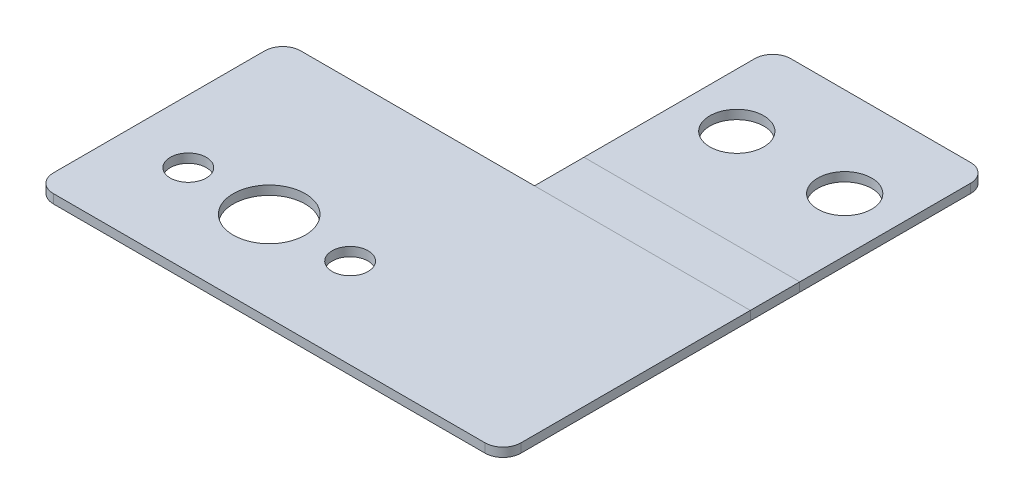
ISO-10303-21;
HEADER;
FILE_DESCRIPTION(('STEP AP214'),'2;1');
FILE_NAME('part.step','',(''),(''),'','','');
FILE_SCHEMA(('AUTOMOTIVE_DESIGN { 1 0 10303 214 1 1 1 1 }'));
ENDSEC;
DATA;
#1=APPLICATION_CONTEXT('core data for automotive mechanical design processes');
#2=APPLICATION_PROTOCOL_DEFINITION('international standard','automotive_design',2000,#1);
#3=PRODUCT_CONTEXT('',#1,'mechanical');
#4=PRODUCT('Part','Part','',(#3));
#5=PRODUCT_RELATED_PRODUCT_CATEGORY('part','',(#4));
#6=PRODUCT_DEFINITION_FORMATION('','',#4);
#7=PRODUCT_DEFINITION_CONTEXT('part definition',#1,'design');
#8=PRODUCT_DEFINITION('design','',#6,#7);
#9=PRODUCT_DEFINITION_SHAPE('','',#8);
#10=(LENGTH_UNIT() NAMED_UNIT(*) SI_UNIT(.MILLI.,.METRE.));
#11=(NAMED_UNIT(*) PLANE_ANGLE_UNIT() SI_UNIT($,.RADIAN.));
#12=(NAMED_UNIT(*) SI_UNIT($,.STERADIAN.) SOLID_ANGLE_UNIT());
#13=UNCERTAINTY_MEASURE_WITH_UNIT(LENGTH_MEASURE(1.E-05),#10,'distance_accuracy_value','');
#14=(GEOMETRIC_REPRESENTATION_CONTEXT(3) GLOBAL_UNCERTAINTY_ASSIGNED_CONTEXT((#13)) GLOBAL_UNIT_ASSIGNED_CONTEXT((#10,
#11,#12)) REPRESENTATION_CONTEXT('',''));
#15=CARTESIAN_POINT('',(0.,0.,0.));
#16=DIRECTION('',(0.,0.,1.));
#17=DIRECTION('',(1.,0.,0.));
#18=AXIS2_PLACEMENT_3D('',#15,#16,#17);
#19=CARTESIAN_POINT('',(6.,-0.5,-13.5));
#20=DIRECTION('',(1.,0.,0.));
#21=DIRECTION('',(0.,0.,-1.));
#22=AXIS2_PLACEMENT_3D('',#19,#20,#21);
#23=PLANE('',#22);
#24=DIRECTION('',(0.,0.,-1.));
#25=VECTOR('',#24,1.);
#26=CARTESIAN_POINT('',(6.,0.,-13.5));
#27=LINE('',#26,#25);
#28=CARTESIAN_POINT('',(6.,0.,12.5));
#29=VERTEX_POINT('',#28);
#30=CARTESIAN_POINT('',(6.,0.,-0.251106428108928));
#31=VERTEX_POINT('',#30);
#32=EDGE_CURVE('E211',#29,#31,#27,.T.);
#33=ORIENTED_EDGE('',*,*,#32,.F.);
#34=DIRECTION('',(0.,1.,0.));
#35=VECTOR('',#34,1.);
#36=CARTESIAN_POINT('',(6.,-0.5,12.5));
#37=LINE('',#36,#35);
#38=CARTESIAN_POINT('',(6.,-0.5,12.5));
#39=VERTEX_POINT('',#38);
#40=EDGE_CURVE('E167',#29,#39,#37,.F.);
#41=ORIENTED_EDGE('',*,*,#40,.T.);
#42=DIRECTION('',(0.,0.,-1.));
#43=VECTOR('',#42,1.);
#44=CARTESIAN_POINT('',(6.,-0.5,-13.5));
#45=LINE('',#44,#43);
#46=CARTESIAN_POINT('',(6.,-0.5,-0.25110642810893));
#47=VERTEX_POINT('',#46);
#48=EDGE_CURVE('E215',#39,#47,#45,.T.);
#49=ORIENTED_EDGE('',*,*,#48,.T.);
#50=DIRECTION('',(0.,1.,0.));
#51=VECTOR('',#50,1.);
#52=CARTESIAN_POINT('',(6.,-0.499999999999999,-0.251106428108928));
#53=LINE('',#52,#51);
#54=EDGE_CURVE('E12',#47,#31,#53,.T.);
#55=ORIENTED_EDGE('',*,*,#54,.T.);
#56=EDGE_LOOP('',(#33,#41,#49,#55));
#57=FACE_BOUND('',#56,.T.);
#58=ADVANCED_FACE('F43',(#57),#23,.T.);
#59=CARTESIAN_POINT('',(0.,0.,0.));
#60=DIRECTION('',(0.,1.,0.));
#61=DIRECTION('',(0.,0.,1.));
#62=AXIS2_PLACEMENT_3D('',#59,#60,#61);
#63=PLANE('',#62);
#64=CARTESIAN_POINT('',(-16.5,0.,8.49999999999999));
#65=DIRECTION('',(0.,1.,0.));
#66=DIRECTION('',(0.,0.,1.));
#67=AXIS2_PLACEMENT_3D('',#64,#65,#66);
#68=CIRCLE('',#67,1.);
#69=CARTESIAN_POINT('',(-16.5,0.,9.49999999999999));
#70=VERTEX_POINT('',#69);
#71=EDGE_CURVE('E223',#70,#70,#68,.T.);
#72=ORIENTED_EDGE('',*,*,#71,.F.);
#73=EDGE_LOOP('',(#72));
#74=FACE_BOUND('',#73,.T.);
#75=CARTESIAN_POINT('',(-7.5,0.,8.49999999999999));
#76=DIRECTION('',(0.,1.,0.));
#77=DIRECTION('',(0.,0.,1.));
#78=AXIS2_PLACEMENT_3D('',#75,#76,#77);
#79=CIRCLE('',#78,1.);
#80=CARTESIAN_POINT('',(-7.5,0.,9.49999999999999));
#81=VERTEX_POINT('',#80);
#82=EDGE_CURVE('E228',#81,#81,#79,.T.);
#83=ORIENTED_EDGE('',*,*,#82,.F.);
#84=EDGE_LOOP('',(#83));
#85=FACE_BOUND('',#84,.T.);
#86=CARTESIAN_POINT('',(-12.,0.,8.49999999999999));
#87=DIRECTION('',(0.,1.,0.));
#88=DIRECTION('',(0.,0.,1.));
#89=AXIS2_PLACEMENT_3D('',#86,#87,#88);
#90=CIRCLE('',#89,2.);
#91=CARTESIAN_POINT('',(-12.,0.,10.5));
#92=VERTEX_POINT('',#91);
#93=EDGE_CURVE('E231',#92,#92,#90,.T.);
#94=ORIENTED_EDGE('',*,*,#93,.F.);
#95=EDGE_LOOP('',(#94));
#96=FACE_BOUND('',#95,.T.);
#97=DIRECTION('',(-1.,0.,0.));
#98=VECTOR('',#97,1.);
#99=CARTESIAN_POINT('',(-20.,0.,-0.251106428108926));
#100=LINE('',#99,#98);
#101=CARTESIAN_POINT('',(-5.99999999999997,0.,-0.251106428108891));
#102=VERTEX_POINT('',#101);
#103=CARTESIAN_POINT('',(-19.,0.,-0.251106428108926));
#104=VERTEX_POINT('',#103);
#105=EDGE_CURVE('E184',#102,#104,#100,.T.);
#106=ORIENTED_EDGE('',*,*,#105,.T.);
#107=CARTESIAN_POINT('',(-19.,0.,0.748893571891074));
#108=DIRECTION('',(0.,1.,0.));
#109=DIRECTION('',(0.,0.,1.));
#110=AXIS2_PLACEMENT_3D('',#107,#108,#109);
#111=CIRCLE('',#110,1.);
#112=CARTESIAN_POINT('',(-20.,0.,0.748893571891074));
#113=VERTEX_POINT('',#112);
#114=EDGE_CURVE('E202',#104,#113,#111,.T.);
#115=ORIENTED_EDGE('',*,*,#114,.T.);
#116=DIRECTION('',(0.,0.,1.));
#117=VECTOR('',#116,1.);
#118=CARTESIAN_POINT('',(-20.,0.,13.5));
#119=LINE('',#118,#117);
#120=CARTESIAN_POINT('',(-20.,0.,12.5));
#121=VERTEX_POINT('',#120);
#122=EDGE_CURVE('E179',#113,#121,#119,.T.);
#123=ORIENTED_EDGE('',*,*,#122,.T.);
#124=CARTESIAN_POINT('',(-19.,0.,12.5));
#125=DIRECTION('',(0.,1.,0.));
#126=DIRECTION('',(0.,0.,1.));
#127=AXIS2_PLACEMENT_3D('',#124,#125,#126);
#128=CIRCLE('',#127,1.);
#129=CARTESIAN_POINT('',(-19.,0.,13.5));
#130=VERTEX_POINT('',#129);
#131=EDGE_CURVE('E204',#121,#130,#128,.T.);
#132=ORIENTED_EDGE('',*,*,#131,.T.);
#133=DIRECTION('',(1.,0.,0.));
#134=VECTOR('',#133,1.);
#135=CARTESIAN_POINT('',(-6.,0.,13.5));
#136=LINE('',#135,#134);
#137=CARTESIAN_POINT('',(5.,0.,13.5));
#138=VERTEX_POINT('',#137);
#139=EDGE_CURVE('E214',#130,#138,#136,.T.);
#140=ORIENTED_EDGE('',*,*,#139,.T.);
#141=CARTESIAN_POINT('',(5.,0.,12.5));
#142=DIRECTION('',(0.,1.,0.));
#143=DIRECTION('',(0.,0.,1.));
#144=AXIS2_PLACEMENT_3D('',#141,#142,#143);
#145=CIRCLE('',#144,1.);
#146=EDGE_CURVE('E206',#138,#29,#145,.T.);
#147=ORIENTED_EDGE('',*,*,#146,.T.);
#148=ORIENTED_EDGE('',*,*,#32,.T.);
#149=DIRECTION('',(-1.,0.,0.));
#150=VECTOR('',#149,1.);
#151=CARTESIAN_POINT('',(0.,0.,-0.251106428108928));
#152=LINE('',#151,#150);
#153=EDGE_CURVE('E51',#31,#102,#152,.T.);
#154=ORIENTED_EDGE('',*,*,#153,.T.);
#155=EDGE_LOOP('',(#106,#115,#123,#132,#140,#147,#148,#154));
#156=FACE_BOUND('',#155,.T.);
#157=ADVANCED_FACE('F307',(#74,#85,#96,#156),#63,.T.);
#158=CARTESIAN_POINT('',(-6.,-0.5,13.5));
#159=DIRECTION('',(0.,0.,1.));
#160=DIRECTION('',(1.,0.,0.));
#161=AXIS2_PLACEMENT_3D('',#158,#159,#160);
#162=PLANE('',#161);
#163=ORIENTED_EDGE('',*,*,#139,.F.);
#164=DIRECTION('',(0.,1.,0.));
#165=VECTOR('',#164,1.);
#166=CARTESIAN_POINT('',(-19.,-0.5,13.5));
#167=LINE('',#166,#165);
#168=CARTESIAN_POINT('',(-19.,-0.5,13.5));
#169=VERTEX_POINT('',#168);
#170=EDGE_CURVE('E188',#130,#169,#167,.F.);
#171=ORIENTED_EDGE('',*,*,#170,.T.);
#172=DIRECTION('',(1.,0.,0.));
#173=VECTOR('',#172,1.);
#174=CARTESIAN_POINT('',(-6.,-0.5,13.5));
#175=LINE('',#174,#173);
#176=CARTESIAN_POINT('',(5.,-0.5,13.5));
#177=VERTEX_POINT('',#176);
#178=EDGE_CURVE('E210',#169,#177,#175,.T.);
#179=ORIENTED_EDGE('',*,*,#178,.T.);
#180=DIRECTION('',(0.,1.,0.));
#181=VECTOR('',#180,1.);
#182=CARTESIAN_POINT('',(5.,-0.5,13.5));
#183=LINE('',#182,#181);
#184=EDGE_CURVE('E190',#177,#138,#183,.T.);
#185=ORIENTED_EDGE('',*,*,#184,.T.);
#186=EDGE_LOOP('',(#163,#171,#179,#185));
#187=FACE_BOUND('',#186,.T.);
#188=ADVANCED_FACE('F314',(#187),#162,.T.);
#189=CARTESIAN_POINT('',(0.,-0.5,0.));
#190=DIRECTION('',(0.,1.,0.));
#191=DIRECTION('',(0.,0.,1.));
#192=AXIS2_PLACEMENT_3D('',#189,#190,#191);
#193=PLANE('',#192);
#194=CARTESIAN_POINT('',(-16.5,-0.500000000000036,8.49999999999999));
#195=DIRECTION('',(0.,-1.,0.));
#196=DIRECTION('',(1.,0.,0.));
#197=AXIS2_PLACEMENT_3D('',#194,#195,#196);
#198=CIRCLE('',#197,1.);
#199=CARTESIAN_POINT('',(-15.5,-0.500000000000036,8.49999999999999));
#200=VERTEX_POINT('',#199);
#201=EDGE_CURVE('E234',#200,#200,#198,.T.);
#202=ORIENTED_EDGE('',*,*,#201,.F.);
#203=EDGE_LOOP('',(#202));
#204=FACE_BOUND('',#203,.T.);
#205=CARTESIAN_POINT('',(-7.5,-0.500000000000036,8.49999999999999));
#206=DIRECTION('',(0.,-1.,0.));
#207=DIRECTION('',(1.,0.,0.));
#208=AXIS2_PLACEMENT_3D('',#205,#206,#207);
#209=CIRCLE('',#208,1.);
#210=CARTESIAN_POINT('',(-6.5,-0.500000000000036,8.49999999999999));
#211=VERTEX_POINT('',#210);
#212=EDGE_CURVE('E238',#211,#211,#209,.T.);
#213=ORIENTED_EDGE('',*,*,#212,.F.);
#214=EDGE_LOOP('',(#213));
#215=FACE_BOUND('',#214,.T.);
#216=CARTESIAN_POINT('',(-12.,-0.500000000000036,8.49999999999999));
#217=DIRECTION('',(0.,-1.,0.));
#218=DIRECTION('',(1.,0.,0.));
#219=AXIS2_PLACEMENT_3D('',#216,#217,#218);
#220=CIRCLE('',#219,2.);
#221=CARTESIAN_POINT('',(-10.,-0.500000000000036,8.49999999999999));
#222=VERTEX_POINT('',#221);
#223=EDGE_CURVE('E235',#222,#222,#220,.T.);
#224=ORIENTED_EDGE('',*,*,#223,.F.);
#225=EDGE_LOOP('',(#224));
#226=FACE_BOUND('',#225,.T.);
#227=DIRECTION('',(0.,0.,1.));
#228=VECTOR('',#227,1.);
#229=CARTESIAN_POINT('',(-20.,-0.5,13.5));
#230=LINE('',#229,#228);
#231=CARTESIAN_POINT('',(-20.,-0.5,0.748893571891074));
#232=VERTEX_POINT('',#231);
#233=CARTESIAN_POINT('',(-20.,-0.5,12.5));
#234=VERTEX_POINT('',#233);
#235=EDGE_CURVE('E178',#232,#234,#230,.T.);
#236=ORIENTED_EDGE('',*,*,#235,.F.);
#237=CARTESIAN_POINT('',(-19.,-0.5,0.748893571891074));
#238=DIRECTION('',(0.,1.,0.));
#239=DIRECTION('',(0.,0.,1.));
#240=AXIS2_PLACEMENT_3D('',#237,#238,#239);
#241=CIRCLE('',#240,1.);
#242=CARTESIAN_POINT('',(-19.,-0.5,-0.251106428108926));
#243=VERTEX_POINT('',#242);
#244=EDGE_CURVE('E174',#232,#243,#241,.F.);
#245=ORIENTED_EDGE('',*,*,#244,.T.);
#246=DIRECTION('',(-1.,0.,0.));
#247=VECTOR('',#246,1.);
#248=CARTESIAN_POINT('',(-20.,-0.5,-0.251106428108926));
#249=LINE('',#248,#247);
#250=CARTESIAN_POINT('',(-5.99999999999997,-0.5,-0.251106428108891));
#251=VERTEX_POINT('',#250);
#252=EDGE_CURVE('E170',#251,#243,#249,.T.);
#253=ORIENTED_EDGE('',*,*,#252,.F.);
#254=DIRECTION('',(-1.,0.,0.));
#255=VECTOR('',#254,1.);
#256=CARTESIAN_POINT('',(0.,-0.5,-0.251106428108928));
#257=LINE('',#256,#255);
#258=EDGE_CURVE('E162',#47,#251,#257,.T.);
#259=ORIENTED_EDGE('',*,*,#258,.F.);
#260=ORIENTED_EDGE('',*,*,#48,.F.);
#261=CARTESIAN_POINT('',(5.,-0.5,12.5));
#262=DIRECTION('',(0.,1.,0.));
#263=DIRECTION('',(0.,0.,1.));
#264=AXIS2_PLACEMENT_3D('',#261,#262,#263);
#265=CIRCLE('',#264,1.);
#266=EDGE_CURVE('E65',#39,#177,#265,.F.);
#267=ORIENTED_EDGE('',*,*,#266,.T.);
#268=ORIENTED_EDGE('',*,*,#178,.F.);
#269=CARTESIAN_POINT('',(-19.,-0.5,12.5));
#270=DIRECTION('',(0.,1.,0.));
#271=DIRECTION('',(0.,0.,1.));
#272=AXIS2_PLACEMENT_3D('',#269,#270,#271);
#273=CIRCLE('',#272,1.);
#274=EDGE_CURVE('E194',#169,#234,#273,.F.);
#275=ORIENTED_EDGE('',*,*,#274,.T.);
#276=EDGE_LOOP('',(#236,#245,#253,#259,#260,#267,#268,#275));
#277=FACE_BOUND('',#276,.T.);
#278=ADVANCED_FACE('F172',(#204,#215,#226,#277),#193,.F.);
#279=CARTESIAN_POINT('',(-20.,-0.5,13.5));
#280=DIRECTION('',(-1.,0.,0.));
#281=DIRECTION('',(0.,0.,-1.));
#282=AXIS2_PLACEMENT_3D('',#279,#280,#281);
#283=PLANE('',#282);
#284=ORIENTED_EDGE('',*,*,#122,.F.);
#285=DIRECTION('',(0.,1.,0.));
#286=VECTOR('',#285,1.);
#287=CARTESIAN_POINT('',(-20.,-0.5,0.748893571891074));
#288=LINE('',#287,#286);
#289=EDGE_CURVE('E197',#113,#232,#288,.F.);
#290=ORIENTED_EDGE('',*,*,#289,.T.);
#291=ORIENTED_EDGE('',*,*,#235,.T.);
#292=DIRECTION('',(0.,1.,0.));
#293=VECTOR('',#292,1.);
#294=CARTESIAN_POINT('',(-20.,-0.5,12.5));
#295=LINE('',#294,#293);
#296=EDGE_CURVE('E199',#234,#121,#295,.T.);
#297=ORIENTED_EDGE('',*,*,#296,.T.);
#298=EDGE_LOOP('',(#284,#290,#291,#297));
#299=FACE_BOUND('',#298,.T.);
#300=ADVANCED_FACE('F322',(#299),#283,.T.);
#301=CARTESIAN_POINT('',(-20.,-0.5,-0.251106428108926));
#302=DIRECTION('',(0.,0.,-1.));
#303=DIRECTION('',(0.,1.,0.));
#304=AXIS2_PLACEMENT_3D('',#301,#302,#303);
#305=PLANE('',#304);
#306=ORIENTED_EDGE('',*,*,#252,.T.);
#307=DIRECTION('',(0.,1.,0.));
#308=VECTOR('',#307,1.);
#309=CARTESIAN_POINT('',(-19.,-0.5,-0.251106428108926));
#310=LINE('',#309,#308);
#311=EDGE_CURVE('E208',#243,#104,#310,.T.);
#312=ORIENTED_EDGE('',*,*,#311,.T.);
#313=ORIENTED_EDGE('',*,*,#105,.F.);
#314=DIRECTION('',(0.,-1.,0.));
#315=VECTOR('',#314,1.);
#316=CARTESIAN_POINT('',(-6.,-0.499999999999999,-0.251106428108928));
#317=LINE('',#316,#315);
#318=EDGE_CURVE('E152',#102,#251,#317,.T.);
#319=ORIENTED_EDGE('',*,*,#318,.T.);
#320=EDGE_LOOP('',(#306,#312,#313,#319));
#321=FACE_BOUND('',#320,.T.);
#322=ADVANCED_FACE('F182',(#321),#305,.T.);
#323=CARTESIAN_POINT('',(-12.,9.49999999999996,8.50000000000002));
#324=DIRECTION('',(0.,-1.,0.));
#325=DIRECTION('',(1.,0.,0.));
#326=AXIS2_PLACEMENT_3D('',#323,#324,#325);
#327=CYLINDRICAL_SURFACE('',#326,2.);
#328=ORIENTED_EDGE('',*,*,#93,.T.);
#329=EDGE_LOOP('',(#328));
#330=FACE_BOUND('',#329,.T.);
#331=ORIENTED_EDGE('',*,*,#223,.T.);
#332=EDGE_LOOP('',(#331));
#333=FACE_BOUND('',#332,.T.);
#334=ADVANCED_FACE('F351',(#330,#333),#327,.F.);
#335=CARTESIAN_POINT('',(-7.5,9.49999999999996,8.50000000000003));
#336=DIRECTION('',(0.,-1.,0.));
#337=DIRECTION('',(1.,0.,0.));
#338=AXIS2_PLACEMENT_3D('',#335,#336,#337);
#339=CYLINDRICAL_SURFACE('',#338,1.);
#340=ORIENTED_EDGE('',*,*,#82,.T.);
#341=EDGE_LOOP('',(#340));
#342=FACE_BOUND('',#341,.T.);
#343=ORIENTED_EDGE('',*,*,#212,.T.);
#344=EDGE_LOOP('',(#343));
#345=FACE_BOUND('',#344,.T.);
#346=ADVANCED_FACE('F333',(#342,#345),#339,.F.);
#347=CARTESIAN_POINT('',(-16.5,9.49999999999996,8.50000000000002));
#348=DIRECTION('',(0.,-1.,0.));
#349=DIRECTION('',(1.,0.,0.));
#350=AXIS2_PLACEMENT_3D('',#347,#348,#349);
#351=CYLINDRICAL_SURFACE('',#350,1.);
#352=ORIENTED_EDGE('',*,*,#71,.T.);
#353=EDGE_LOOP('',(#352));
#354=FACE_BOUND('',#353,.T.);
#355=ORIENTED_EDGE('',*,*,#201,.T.);
#356=EDGE_LOOP('',(#355));
#357=FACE_BOUND('',#356,.T.);
#358=ADVANCED_FACE('F327',(#354,#357),#351,.F.);
#359=CARTESIAN_POINT('',(-19.,-0.5,0.748893571891074));
#360=DIRECTION('',(0.,1.,0.));
#361=DIRECTION('',(0.,0.,1.));
#362=AXIS2_PLACEMENT_3D('',#359,#360,#361);
#363=CYLINDRICAL_SURFACE('',#362,1.);
#364=ORIENTED_EDGE('',*,*,#244,.F.);
#365=ORIENTED_EDGE('',*,*,#289,.F.);
#366=ORIENTED_EDGE('',*,*,#114,.F.);
#367=ORIENTED_EDGE('',*,*,#311,.F.);
#368=EDGE_LOOP('',(#364,#365,#366,#367));
#369=FACE_BOUND('',#368,.T.);
#370=ADVANCED_FACE('F325',(#369),#363,.T.);
#371=CARTESIAN_POINT('',(-19.,-0.5,12.5));
#372=DIRECTION('',(0.,1.,0.));
#373=DIRECTION('',(0.,0.,1.));
#374=AXIS2_PLACEMENT_3D('',#371,#372,#373);
#375=CYLINDRICAL_SURFACE('',#374,1.);
#376=ORIENTED_EDGE('',*,*,#274,.F.);
#377=ORIENTED_EDGE('',*,*,#170,.F.);
#378=ORIENTED_EDGE('',*,*,#131,.F.);
#379=ORIENTED_EDGE('',*,*,#296,.F.);
#380=EDGE_LOOP('',(#376,#377,#378,#379));
#381=FACE_BOUND('',#380,.T.);
#382=ADVANCED_FACE('F320',(#381),#375,.T.);
#383=CARTESIAN_POINT('',(5.,-0.5,12.5));
#384=DIRECTION('',(0.,1.,0.));
#385=DIRECTION('',(0.,0.,1.));
#386=AXIS2_PLACEMENT_3D('',#383,#384,#385);
#387=CYLINDRICAL_SURFACE('',#386,1.);
#388=ORIENTED_EDGE('',*,*,#266,.F.);
#389=ORIENTED_EDGE('',*,*,#40,.F.);
#390=ORIENTED_EDGE('',*,*,#146,.F.);
#391=ORIENTED_EDGE('',*,*,#184,.F.);
#392=EDGE_LOOP('',(#388,#389,#390,#391));
#393=FACE_BOUND('',#392,.T.);
#394=ADVANCED_FACE('F45',(#393),#387,.T.);
#395=CARTESIAN_POINT('',(5.,-0.5,-12.5));
#396=DIRECTION('',(0.,1.,0.));
#397=DIRECTION('',(0.,0.,1.));
#398=AXIS2_PLACEMENT_3D('',#395,#396,#397);
#399=CYLINDRICAL_SURFACE('',#398,1.);
#400=CARTESIAN_POINT('',(5.,-0.5,-12.5));
#401=DIRECTION('',(0.,1.,0.));
#402=DIRECTION('',(0.,0.,1.));
#403=AXIS2_PLACEMENT_3D('',#400,#401,#402);
#404=CIRCLE('',#403,1.);
#405=CARTESIAN_POINT('',(5.,-0.5,-13.5));
#406=VERTEX_POINT('',#405);
#407=CARTESIAN_POINT('',(6.,-0.5,-12.5));
#408=VERTEX_POINT('',#407);
#409=EDGE_CURVE('E273',#406,#408,#404,.F.);
#410=ORIENTED_EDGE('',*,*,#409,.F.);
#411=DIRECTION('',(0.,1.,0.));
#412=VECTOR('',#411,1.);
#413=CARTESIAN_POINT('',(5.,-0.5,-13.5));
#414=LINE('',#413,#412);
#415=CARTESIAN_POINT('',(5.,0.,-13.5));
#416=VERTEX_POINT('',#415);
#417=EDGE_CURVE('E257',#416,#406,#414,.F.);
#418=ORIENTED_EDGE('',*,*,#417,.F.);
#419=CARTESIAN_POINT('',(5.,0.,-12.5));
#420=DIRECTION('',(0.,1.,0.));
#421=DIRECTION('',(0.,0.,1.));
#422=AXIS2_PLACEMENT_3D('',#419,#420,#421);
#423=CIRCLE('',#422,1.);
#424=CARTESIAN_POINT('',(6.,0.,-12.5));
#425=VERTEX_POINT('',#424);
#426=EDGE_CURVE('E292',#425,#416,#423,.T.);
#427=ORIENTED_EDGE('',*,*,#426,.F.);
#428=DIRECTION('',(0.,1.,0.));
#429=VECTOR('',#428,1.);
#430=CARTESIAN_POINT('',(6.,-0.5,-12.5));
#431=LINE('',#430,#429);
#432=EDGE_CURVE('E239',#408,#425,#431,.T.);
#433=ORIENTED_EDGE('',*,*,#432,.F.);
#434=EDGE_LOOP('',(#410,#418,#427,#433));
#435=FACE_BOUND('',#434,.T.);
#436=ADVANCED_FACE('F391',(#435),#399,.T.);
#437=CARTESIAN_POINT('',(-6.,-0.5,-13.5));
#438=DIRECTION('',(0.,0.,-1.));
#439=DIRECTION('',(-1.,0.,0.));
#440=AXIS2_PLACEMENT_3D('',#437,#438,#439);
#441=PLANE('',#440);
#442=DIRECTION('',(-1.,0.,0.));
#443=VECTOR('',#442,1.);
#444=CARTESIAN_POINT('',(-6.,-0.5,-13.5));
#445=LINE('',#444,#443);
#446=CARTESIAN_POINT('',(-5.,-0.5,-13.5));
#447=VERTEX_POINT('',#446);
#448=EDGE_CURVE('E251',#406,#447,#445,.T.);
#449=ORIENTED_EDGE('',*,*,#448,.T.);
#450=DIRECTION('',(0.,1.,0.));
#451=VECTOR('',#450,1.);
#452=CARTESIAN_POINT('',(-5.,-0.5,-13.5));
#453=LINE('',#452,#451);
#454=CARTESIAN_POINT('',(-5.,0.,-13.5));
#455=VERTEX_POINT('',#454);
#456=EDGE_CURVE('E254',#447,#455,#453,.T.);
#457=ORIENTED_EDGE('',*,*,#456,.T.);
#458=DIRECTION('',(-1.,0.,0.));
#459=VECTOR('',#458,1.);
#460=CARTESIAN_POINT('',(-6.,0.,-13.5));
#461=LINE('',#460,#459);
#462=EDGE_CURVE('E282',#416,#455,#461,.T.);
#463=ORIENTED_EDGE('',*,*,#462,.F.);
#464=ORIENTED_EDGE('',*,*,#417,.T.);
#465=EDGE_LOOP('',(#449,#457,#463,#464));
#466=FACE_BOUND('',#465,.T.);
#467=ADVANCED_FACE('F387',(#466),#441,.T.);
#468=CARTESIAN_POINT('',(-5.,-0.5,-12.5));
#469=DIRECTION('',(0.,1.,0.));
#470=DIRECTION('',(0.,0.,1.));
#471=AXIS2_PLACEMENT_3D('',#468,#469,#470);
#472=CYLINDRICAL_SURFACE('',#471,1.);
#473=CARTESIAN_POINT('',(-5.,-0.5,-12.5));
#474=DIRECTION('',(0.,1.,0.));
#475=DIRECTION('',(0.,0.,1.));
#476=AXIS2_PLACEMENT_3D('',#473,#474,#475);
#477=CIRCLE('',#476,1.);
#478=CARTESIAN_POINT('',(-6.,-0.5,-12.5));
#479=VERTEX_POINT('',#478);
#480=EDGE_CURVE('E271',#479,#447,#477,.F.);
#481=ORIENTED_EDGE('',*,*,#480,.F.);
#482=DIRECTION('',(0.,1.,0.));
#483=VECTOR('',#482,1.);
#484=CARTESIAN_POINT('',(-6.,-0.5,-12.5));
#485=LINE('',#484,#483);
#486=CARTESIAN_POINT('',(-6.,0.,-12.5));
#487=VERTEX_POINT('',#486);
#488=EDGE_CURVE('E277',#487,#479,#485,.F.);
#489=ORIENTED_EDGE('',*,*,#488,.F.);
#490=CARTESIAN_POINT('',(-5.,0.,-12.5));
#491=DIRECTION('',(0.,1.,0.));
#492=DIRECTION('',(0.,0.,1.));
#493=AXIS2_PLACEMENT_3D('',#490,#491,#492);
#494=CIRCLE('',#493,1.);
#495=EDGE_CURVE('E285',#455,#487,#494,.T.);
#496=ORIENTED_EDGE('',*,*,#495,.F.);
#497=ORIENTED_EDGE('',*,*,#456,.F.);
#498=EDGE_LOOP('',(#481,#489,#496,#497));
#499=FACE_BOUND('',#498,.T.);
#500=ADVANCED_FACE('F383',(#499),#472,.T.);
#501=CARTESIAN_POINT('',(3.,-10.,-8.5));
#502=DIRECTION('',(0.,1.,0.));
#503=DIRECTION('',(0.,0.,1.));
#504=AXIS2_PLACEMENT_3D('',#501,#502,#503);
#505=CYLINDRICAL_SURFACE('',#504,1.5);
#506=CARTESIAN_POINT('',(3.,0.,-8.5));
#507=DIRECTION('',(0.,1.,0.));
#508=DIRECTION('',(0.,0.,1.));
#509=AXIS2_PLACEMENT_3D('',#506,#507,#508);
#510=CIRCLE('',#509,1.5);
#511=CARTESIAN_POINT('',(3.,0.,-7.));
#512=VERTEX_POINT('',#511);
#513=EDGE_CURVE('E259',#512,#512,#510,.T.);
#514=ORIENTED_EDGE('',*,*,#513,.T.);
#515=EDGE_LOOP('',(#514));
#516=FACE_BOUND('',#515,.T.);
#517=CARTESIAN_POINT('',(3.,-0.5,-8.5));
#518=DIRECTION('',(0.,1.,0.));
#519=DIRECTION('',(0.,0.,1.));
#520=AXIS2_PLACEMENT_3D('',#517,#518,#519);
#521=CIRCLE('',#520,1.5);
#522=CARTESIAN_POINT('',(3.,-0.5,-7.));
#523=VERTEX_POINT('',#522);
#524=EDGE_CURVE('E268',#523,#523,#521,.T.);
#525=ORIENTED_EDGE('',*,*,#524,.F.);
#526=EDGE_LOOP('',(#525));
#527=FACE_BOUND('',#526,.T.);
#528=ADVANCED_FACE('F379',(#516,#527),#505,.F.);
#529=CARTESIAN_POINT('',(-3.,-10.,-8.5));
#530=DIRECTION('',(0.,1.,0.));
#531=DIRECTION('',(0.,0.,1.));
#532=AXIS2_PLACEMENT_3D('',#529,#530,#531);
#533=CYLINDRICAL_SURFACE('',#532,1.5);
#534=CARTESIAN_POINT('',(-3.,0.,-8.5));
#535=DIRECTION('',(0.,1.,0.));
#536=DIRECTION('',(0.,0.,1.));
#537=AXIS2_PLACEMENT_3D('',#534,#535,#536);
#538=CIRCLE('',#537,1.5);
#539=CARTESIAN_POINT('',(-3.,0.,-7.));
#540=VERTEX_POINT('',#539);
#541=EDGE_CURVE('E262',#540,#540,#538,.T.);
#542=ORIENTED_EDGE('',*,*,#541,.T.);
#543=EDGE_LOOP('',(#542));
#544=FACE_BOUND('',#543,.T.);
#545=CARTESIAN_POINT('',(-3.,-0.5,-8.5));
#546=DIRECTION('',(0.,1.,0.));
#547=DIRECTION('',(0.,0.,1.));
#548=AXIS2_PLACEMENT_3D('',#545,#546,#547);
#549=CIRCLE('',#548,1.5);
#550=CARTESIAN_POINT('',(-3.,-0.5,-7.));
#551=VERTEX_POINT('',#550);
#552=EDGE_CURVE('E265',#551,#551,#549,.T.);
#553=ORIENTED_EDGE('',*,*,#552,.F.);
#554=EDGE_LOOP('',(#553));
#555=FACE_BOUND('',#554,.T.);
#556=ADVANCED_FACE('F375',(#544,#555),#533,.F.);
#557=CARTESIAN_POINT('',(0.,-0.5,0.));
#558=DIRECTION('',(0.,1.,0.));
#559=DIRECTION('',(0.,0.,1.));
#560=AXIS2_PLACEMENT_3D('',#557,#558,#559);
#561=PLANE('',#560);
#562=ORIENTED_EDGE('',*,*,#552,.T.);
#563=EDGE_LOOP('',(#562));
#564=FACE_BOUND('',#563,.T.);
#565=ORIENTED_EDGE('',*,*,#524,.T.);
#566=EDGE_LOOP('',(#565));
#567=FACE_BOUND('',#566,.T.);
#568=DIRECTION('',(0.,0.,1.));
#569=VECTOR('',#568,1.);
#570=CARTESIAN_POINT('',(-6.,-0.5,-13.5));
#571=LINE('',#570,#569);
#572=CARTESIAN_POINT('',(-5.99999999999998,-0.5,-2.99999999999999));
#573=VERTEX_POINT('',#572);
#574=EDGE_CURVE('E279',#479,#573,#571,.T.);
#575=ORIENTED_EDGE('',*,*,#574,.F.);
#576=ORIENTED_EDGE('',*,*,#480,.T.);
#577=ORIENTED_EDGE('',*,*,#448,.F.);
#578=ORIENTED_EDGE('',*,*,#409,.T.);
#579=DIRECTION('',(0.,0.,-1.));
#580=VECTOR('',#579,1.);
#581=CARTESIAN_POINT('',(6.,-0.5,-13.5));
#582=LINE('',#581,#580);
#583=CARTESIAN_POINT('',(6.,-0.5,-2.99999999999999));
#584=VERTEX_POINT('',#583);
#585=EDGE_CURVE('E294',#584,#408,#582,.T.);
#586=ORIENTED_EDGE('',*,*,#585,.F.);
#587=DIRECTION('',(-1.,0.,0.));
#588=VECTOR('',#587,1.);
#589=CARTESIAN_POINT('',(0.,-0.5,-2.99999999999999));
#590=LINE('',#589,#588);
#591=EDGE_CURVE('E275',#584,#573,#590,.T.);
#592=ORIENTED_EDGE('',*,*,#591,.T.);
#593=EDGE_LOOP('',(#575,#576,#577,#578,#586,#592));
#594=FACE_BOUND('',#593,.T.);
#595=ADVANCED_FACE('F371',(#564,#567,#594),#561,.F.);
#596=CARTESIAN_POINT('',(-6.,-0.5,-13.5));
#597=DIRECTION('',(-1.,0.,0.));
#598=DIRECTION('',(0.,0.,1.));
#599=AXIS2_PLACEMENT_3D('',#596,#597,#598);
#600=PLANE('',#599);
#601=DIRECTION('',(0.,0.,1.));
#602=VECTOR('',#601,1.);
#603=CARTESIAN_POINT('',(-6.,0.,-13.5));
#604=LINE('',#603,#602);
#605=CARTESIAN_POINT('',(-6.,0.,-2.99999999999999));
#606=VERTEX_POINT('',#605);
#607=EDGE_CURVE('E287',#487,#606,#604,.T.);
#608=ORIENTED_EDGE('',*,*,#607,.F.);
#609=ORIENTED_EDGE('',*,*,#488,.T.);
#610=ORIENTED_EDGE('',*,*,#574,.T.);
#611=DIRECTION('',(0.,-1.,0.));
#612=VECTOR('',#611,1.);
#613=CARTESIAN_POINT('',(-6.,-0.499999999999999,-2.99999999999999));
#614=LINE('',#613,#612);
#615=EDGE_CURVE('E154',#606,#573,#614,.T.);
#616=ORIENTED_EDGE('',*,*,#615,.F.);
#617=EDGE_LOOP('',(#608,#609,#610,#616));
#618=FACE_BOUND('',#617,.T.);
#619=ADVANCED_FACE('F367',(#618),#600,.T.);
#620=CARTESIAN_POINT('',(0.,0.,0.));
#621=DIRECTION('',(0.,1.,0.));
#622=DIRECTION('',(0.,0.,1.));
#623=AXIS2_PLACEMENT_3D('',#620,#621,#622);
#624=PLANE('',#623);
#625=ORIENTED_EDGE('',*,*,#541,.F.);
#626=EDGE_LOOP('',(#625));
#627=FACE_BOUND('',#626,.T.);
#628=ORIENTED_EDGE('',*,*,#513,.F.);
#629=EDGE_LOOP('',(#628));
#630=FACE_BOUND('',#629,.T.);
#631=ORIENTED_EDGE('',*,*,#462,.T.);
#632=ORIENTED_EDGE('',*,*,#495,.T.);
#633=ORIENTED_EDGE('',*,*,#607,.T.);
#634=DIRECTION('',(-1.,0.,0.));
#635=VECTOR('',#634,1.);
#636=CARTESIAN_POINT('',(0.,0.,-2.99999999999999));
#637=LINE('',#636,#635);
#638=CARTESIAN_POINT('',(6.,0.,-2.99999999999999));
#639=VERTEX_POINT('',#638);
#640=EDGE_CURVE('E247',#639,#606,#637,.T.);
#641=ORIENTED_EDGE('',*,*,#640,.F.);
#642=DIRECTION('',(0.,0.,-1.));
#643=VECTOR('',#642,1.);
#644=CARTESIAN_POINT('',(6.,0.,-13.5));
#645=LINE('',#644,#643);
#646=EDGE_CURVE('E289',#639,#425,#645,.T.);
#647=ORIENTED_EDGE('',*,*,#646,.T.);
#648=ORIENTED_EDGE('',*,*,#426,.T.);
#649=EDGE_LOOP('',(#631,#632,#633,#641,#647,#648));
#650=FACE_BOUND('',#649,.T.);
#651=ADVANCED_FACE('F363',(#627,#630,#650),#624,.T.);
#652=CARTESIAN_POINT('',(6.,-0.5,-13.5));
#653=DIRECTION('',(1.,0.,0.));
#654=DIRECTION('',(0.,0.,-1.));
#655=AXIS2_PLACEMENT_3D('',#652,#653,#654);
#656=PLANE('',#655);
#657=ORIENTED_EDGE('',*,*,#585,.T.);
#658=ORIENTED_EDGE('',*,*,#432,.T.);
#659=ORIENTED_EDGE('',*,*,#646,.F.);
#660=DIRECTION('',(0.,1.,0.));
#661=VECTOR('',#660,1.);
#662=CARTESIAN_POINT('',(6.,-0.499999999999999,-2.99999999999999));
#663=LINE('',#662,#661);
#664=EDGE_CURVE('E244',#584,#639,#663,.T.);
#665=ORIENTED_EDGE('',*,*,#664,.F.);
#666=EDGE_LOOP('',(#657,#658,#659,#665));
#667=FACE_BOUND('',#666,.T.);
#668=ADVANCED_FACE('F360',(#667),#656,.T.);
#669=CARTESIAN_POINT('',(-5.99999999999997,-0.5,-0.251106428108891));
#670=DIRECTION('',(-1.,0.,0.));
#671=DIRECTION('',(0.,0.,-1.));
#672=AXIS2_PLACEMENT_3D('',#669,#670,#671);
#673=PLANE('',#672);
#674=ORIENTED_EDGE('',*,*,#318,.F.);
#675=DIRECTION('',(0.,0.,-1.));
#676=VECTOR('',#675,1.);
#677=CARTESIAN_POINT('',(-5.99999999999997,0.,-1.62555321405445));
#678=LINE('',#677,#676);
#679=EDGE_CURVE('E299',#102,#606,#678,.T.);
#680=ORIENTED_EDGE('',*,*,#679,.T.);
#681=ORIENTED_EDGE('',*,*,#615,.T.);
#682=DIRECTION('',(0.,0.,-1.));
#683=VECTOR('',#682,1.);
#684=CARTESIAN_POINT('',(-5.99999999999997,-0.5,-0.251106428108891));
#685=LINE('',#684,#683);
#686=EDGE_CURVE('E147',#251,#573,#685,.T.);
#687=ORIENTED_EDGE('',*,*,#686,.F.);
#688=EDGE_LOOP('',(#674,#680,#681,#687));
#689=FACE_BOUND('',#688,.T.);
#690=ADVANCED_FACE('F149',(#689),#673,.T.);
#691=CARTESIAN_POINT('',(6.,-0.5,-2.99999999999999));
#692=DIRECTION('',(1.,0.,0.));
#693=DIRECTION('',(0.,0.,1.));
#694=AXIS2_PLACEMENT_3D('',#691,#692,#693);
#695=PLANE('',#694);
#696=ORIENTED_EDGE('',*,*,#664,.T.);
#697=DIRECTION('',(0.,0.,-1.));
#698=VECTOR('',#697,1.);
#699=CARTESIAN_POINT('',(6.,0.,-1.62555321405445));
#700=LINE('',#699,#698);
#701=EDGE_CURVE('E158',#639,#31,#700,.F.);
#702=ORIENTED_EDGE('',*,*,#701,.T.);
#703=ORIENTED_EDGE('',*,*,#54,.F.);
#704=DIRECTION('',(0.,0.,1.));
#705=VECTOR('',#704,1.);
#706=CARTESIAN_POINT('',(6.,-0.5,-2.99999999999999));
#707=LINE('',#706,#705);
#708=EDGE_CURVE('E157',#584,#47,#707,.T.);
#709=ORIENTED_EDGE('',*,*,#708,.F.);
#710=EDGE_LOOP('',(#696,#702,#703,#709));
#711=FACE_BOUND('',#710,.T.);
#712=ADVANCED_FACE('F303',(#711),#695,.T.);
#713=CARTESIAN_POINT('',(0.,-0.5,-1.62555321405445));
#714=DIRECTION('',(0.,-1.,0.));
#715=DIRECTION('',(0.,0.,-1.));
#716=AXIS2_PLACEMENT_3D('',#713,#714,#715);
#717=PLANE('',#716);
#718=ORIENTED_EDGE('',*,*,#708,.T.);
#719=ORIENTED_EDGE('',*,*,#258,.T.);
#720=ORIENTED_EDGE('',*,*,#686,.T.);
#721=ORIENTED_EDGE('',*,*,#591,.F.);
#722=EDGE_LOOP('',(#718,#719,#720,#721));
#723=FACE_BOUND('',#722,.T.);
#724=ADVANCED_FACE('F164',(#723),#717,.T.);
#725=CARTESIAN_POINT('',(0.,0.,-1.62555321405445));
#726=DIRECTION('',(0.,-1.,0.));
#727=DIRECTION('',(0.,0.,-1.));
#728=AXIS2_PLACEMENT_3D('',#725,#726,#727);
#729=PLANE('',#728);
#730=ORIENTED_EDGE('',*,*,#701,.F.);
#731=ORIENTED_EDGE('',*,*,#640,.T.);
#732=ORIENTED_EDGE('',*,*,#679,.F.);
#733=ORIENTED_EDGE('',*,*,#153,.F.);
#734=EDGE_LOOP('',(#730,#731,#732,#733));
#735=FACE_BOUND('',#734,.T.);
#736=ADVANCED_FACE('F400',(#735),#729,.F.);
#737=CLOSED_SHELL('',(#58,#157,#188,#278,#300,#322,#334,#346,#358,#370,#382,#394,#436,#467,#500,
#528,#556,#595,#619,#651,#668,#690,#712,#724,#736));
#738=MANIFOLD_SOLID_BREP('B2',#737);
#739=ADVANCED_BREP_SHAPE_REPRESENTATION('',(#18,#738),#14);
#740=SHAPE_DEFINITION_REPRESENTATION(#9,#739);
ENDSEC;
END-ISO-10303-21;
